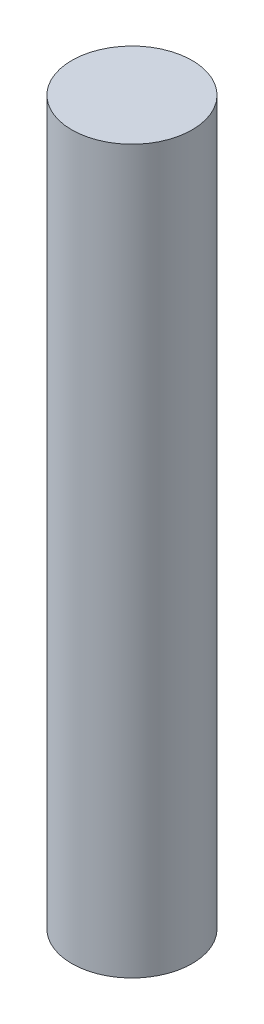
ISO-10303-21;
HEADER;
FILE_DESCRIPTION(('STEP AP214'),'2;1');
FILE_NAME('part.step','',(''),(''),'','','');
FILE_SCHEMA(('AUTOMOTIVE_DESIGN { 1 0 10303 214 1 1 1 1 }'));
ENDSEC;
DATA;
#1=APPLICATION_CONTEXT('core data for automotive mechanical design processes');
#2=APPLICATION_PROTOCOL_DEFINITION('international standard','automotive_design',2000,#1);
#3=PRODUCT_CONTEXT('',#1,'mechanical');
#4=PRODUCT('Part','Part','',(#3));
#5=PRODUCT_RELATED_PRODUCT_CATEGORY('part','',(#4));
#6=PRODUCT_DEFINITION_FORMATION('','',#4);
#7=PRODUCT_DEFINITION_CONTEXT('part definition',#1,'design');
#8=PRODUCT_DEFINITION('design','',#6,#7);
#9=PRODUCT_DEFINITION_SHAPE('','',#8);
#10=(LENGTH_UNIT() NAMED_UNIT(*) SI_UNIT(.MILLI.,.METRE.));
#11=(NAMED_UNIT(*) PLANE_ANGLE_UNIT() SI_UNIT($,.RADIAN.));
#12=(NAMED_UNIT(*) SI_UNIT($,.STERADIAN.) SOLID_ANGLE_UNIT());
#13=UNCERTAINTY_MEASURE_WITH_UNIT(LENGTH_MEASURE(1.E-05),#10,'distance_accuracy_value','');
#14=(GEOMETRIC_REPRESENTATION_CONTEXT(3) GLOBAL_UNCERTAINTY_ASSIGNED_CONTEXT((#13)) GLOBAL_UNIT_ASSIGNED_CONTEXT((#10,
#11,#12)) REPRESENTATION_CONTEXT('',''));
#15=CARTESIAN_POINT('',(0.,0.,0.));
#16=DIRECTION('',(0.,0.,1.));
#17=DIRECTION('',(1.,0.,0.));
#18=AXIS2_PLACEMENT_3D('',#15,#16,#17);
#19=CARTESIAN_POINT('',(0.,12.,0.));
#20=DIRECTION('',(0.,-1.,0.));
#21=DIRECTION('',(0.,0.,-1.));
#22=AXIS2_PLACEMENT_3D('',#19,#20,#21);
#23=CYLINDRICAL_SURFACE('',#22,1.);
#24=CARTESIAN_POINT('',(0.,12.,0.));
#25=DIRECTION('',(0.,1.,0.));
#26=DIRECTION('',(0.,0.,1.));
#27=AXIS2_PLACEMENT_3D('',#24,#25,#26);
#28=CIRCLE('',#27,1.);
#29=CARTESIAN_POINT('',(0.,12.,1.));
#30=VERTEX_POINT('',#29);
#31=EDGE_CURVE('E10',#30,#30,#28,.T.);
#32=ORIENTED_EDGE('',*,*,#31,.F.);
#33=EDGE_LOOP('',(#32));
#34=FACE_BOUND('',#33,.T.);
#35=CARTESIAN_POINT('',(0.,0.,0.));
#36=DIRECTION('',(0.,1.,0.));
#37=DIRECTION('',(0.,0.,1.));
#38=AXIS2_PLACEMENT_3D('',#35,#36,#37);
#39=CIRCLE('',#38,1.);
#40=CARTESIAN_POINT('',(0.,0.,1.));
#41=VERTEX_POINT('',#40);
#42=EDGE_CURVE('E39',#41,#41,#39,.T.);
#43=ORIENTED_EDGE('',*,*,#42,.T.);
#44=EDGE_LOOP('',(#43));
#45=FACE_BOUND('',#44,.T.);
#46=ADVANCED_FACE('F36',(#34,#45),#23,.T.);
#47=CARTESIAN_POINT('',(0.,12.,0.));
#48=DIRECTION('',(0.,1.,0.));
#49=DIRECTION('',(0.,0.,1.));
#50=AXIS2_PLACEMENT_3D('',#47,#48,#49);
#51=PLANE('',#50);
#52=ORIENTED_EDGE('',*,*,#31,.T.);
#53=EDGE_LOOP('',(#52));
#54=FACE_BOUND('',#53,.T.);
#55=ADVANCED_FACE('F51',(#54),#51,.T.);
#56=CARTESIAN_POINT('',(0.,0.,0.));
#57=DIRECTION('',(0.,1.,0.));
#58=DIRECTION('',(0.,0.,1.));
#59=AXIS2_PLACEMENT_3D('',#56,#57,#58);
#60=PLANE('',#59);
#61=ORIENTED_EDGE('',*,*,#42,.F.);
#62=EDGE_LOOP('',(#61));
#63=FACE_BOUND('',#62,.T.);
#64=ADVANCED_FACE('F49',(#63),#60,.F.);
#65=CLOSED_SHELL('',(#46,#55,#64));
#66=MANIFOLD_SOLID_BREP('B2',#65);
#67=ADVANCED_BREP_SHAPE_REPRESENTATION('',(#18,#66),#14);
#68=SHAPE_DEFINITION_REPRESENTATION(#9,#67);
ENDSEC;
END-ISO-10303-21;
